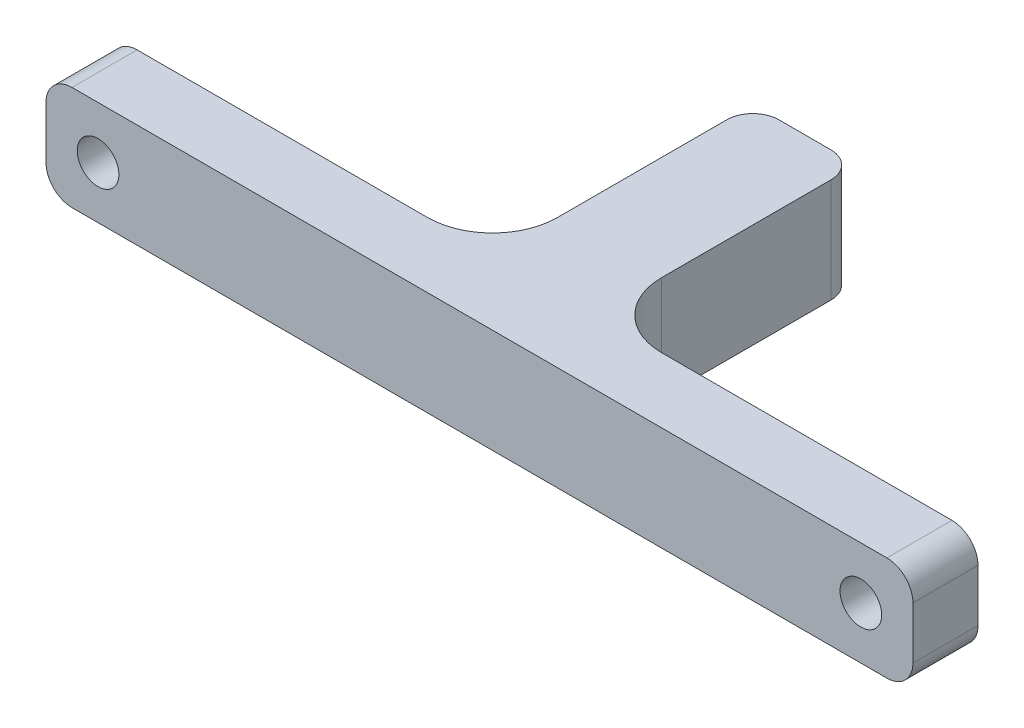
ISO-10303-21;
HEADER;
FILE_DESCRIPTION(('STEP AP214'),'2;1');
FILE_NAME('part.step','',(''),(''),'','','');
FILE_SCHEMA(('AUTOMOTIVE_DESIGN { 1 0 10303 214 1 1 1 1 }'));
ENDSEC;
DATA;
#1=APPLICATION_CONTEXT('core data for automotive mechanical design processes');
#2=APPLICATION_PROTOCOL_DEFINITION('international standard','automotive_design',2000,#1);
#3=PRODUCT_CONTEXT('',#1,'mechanical');
#4=PRODUCT('Part','Part','',(#3));
#5=PRODUCT_RELATED_PRODUCT_CATEGORY('part','',(#4));
#6=PRODUCT_DEFINITION_FORMATION('','',#4);
#7=PRODUCT_DEFINITION_CONTEXT('part definition',#1,'design');
#8=PRODUCT_DEFINITION('design','',#6,#7);
#9=PRODUCT_DEFINITION_SHAPE('','',#8);
#10=(LENGTH_UNIT() NAMED_UNIT(*) SI_UNIT(.MILLI.,.METRE.));
#11=(NAMED_UNIT(*) PLANE_ANGLE_UNIT() SI_UNIT($,.RADIAN.));
#12=(NAMED_UNIT(*) SI_UNIT($,.STERADIAN.) SOLID_ANGLE_UNIT());
#13=UNCERTAINTY_MEASURE_WITH_UNIT(LENGTH_MEASURE(1.E-05),#10,'distance_accuracy_value','');
#14=(GEOMETRIC_REPRESENTATION_CONTEXT(3) GLOBAL_UNCERTAINTY_ASSIGNED_CONTEXT((#13)) GLOBAL_UNIT_ASSIGNED_CONTEXT((#10,
#11,#12)) REPRESENTATION_CONTEXT('',''));
#15=CARTESIAN_POINT('',(0.,0.,0.));
#16=DIRECTION('',(0.,0.,1.));
#17=DIRECTION('',(1.,0.,0.));
#18=AXIS2_PLACEMENT_3D('',#15,#16,#17);
#19=CARTESIAN_POINT('',(0.,0.,0.));
#20=DIRECTION('',(0.,0.,1.));
#21=DIRECTION('',(1.,0.,0.));
#22=AXIS2_PLACEMENT_3D('',#19,#20,#21);
#23=PLANE('',#22);
#24=CARTESIAN_POINT('',(-29.3,0.,0.));
#25=DIRECTION('',(0.,0.,1.));
#26=DIRECTION('',(1.,0.,0.));
#27=AXIS2_PLACEMENT_3D('',#24,#25,#26);
#28=CIRCLE('',#27,1.6);
#29=CARTESIAN_POINT('',(-27.7,0.,0.));
#30=VERTEX_POINT('',#29);
#31=EDGE_CURVE('E283',#30,#30,#28,.T.);
#32=ORIENTED_EDGE('',*,*,#31,.T.);
#33=EDGE_LOOP('',(#32));
#34=FACE_BOUND('',#33,.T.);
#35=DIRECTION('',(-1.,0.,0.));
#36=VECTOR('',#35,1.);
#37=CARTESIAN_POINT('',(33.3,4.00000000000001,0.));
#38=LINE('',#37,#36);
#39=CARTESIAN_POINT('',(-9.00000000000001,4.,0.));
#40=VERTEX_POINT('',#39);
#41=CARTESIAN_POINT('',(-31.3,3.99999999999999,0.));
#42=VERTEX_POINT('',#41);
#43=EDGE_CURVE('E176',#40,#42,#38,.T.);
#44=ORIENTED_EDGE('',*,*,#43,.F.);
#45=DIRECTION('',(0.,1.,0.));
#46=VECTOR('',#45,1.);
#47=CARTESIAN_POINT('',(-9.00000000000001,0.,0.));
#48=LINE('',#47,#46);
#49=CARTESIAN_POINT('',(-9.00000000000001,-4.,0.));
#50=VERTEX_POINT('',#49);
#51=EDGE_CURVE('E225',#40,#50,#48,.F.);
#52=ORIENTED_EDGE('',*,*,#51,.T.);
#53=DIRECTION('',(1.,0.,0.));
#54=VECTOR('',#53,1.);
#55=CARTESIAN_POINT('',(33.3,-3.99999999999999,0.));
#56=LINE('',#55,#54);
#57=CARTESIAN_POINT('',(-31.3,-4.,0.));
#58=VERTEX_POINT('',#57);
#59=EDGE_CURVE('E177',#58,#50,#56,.T.);
#60=ORIENTED_EDGE('',*,*,#59,.F.);
#61=CARTESIAN_POINT('',(-31.3,-2.,0.));
#62=DIRECTION('',(0.,0.,1.));
#63=DIRECTION('',(1.,0.,0.));
#64=AXIS2_PLACEMENT_3D('',#61,#62,#63);
#65=CIRCLE('',#64,2.);
#66=CARTESIAN_POINT('',(-33.3,-2.,0.));
#67=VERTEX_POINT('',#66);
#68=EDGE_CURVE('E210',#58,#67,#65,.F.);
#69=ORIENTED_EDGE('',*,*,#68,.T.);
#70=DIRECTION('',(0.,-1.,0.));
#71=VECTOR('',#70,1.);
#72=CARTESIAN_POINT('',(-33.3,-4.,0.));
#73=LINE('',#72,#71);
#74=CARTESIAN_POINT('',(-33.3,1.99999999999999,0.));
#75=VERTEX_POINT('',#74);
#76=EDGE_CURVE('E291',#75,#67,#73,.T.);
#77=ORIENTED_EDGE('',*,*,#76,.F.);
#78=CARTESIAN_POINT('',(-31.3,1.99999999999999,0.));
#79=DIRECTION('',(0.,0.,1.));
#80=DIRECTION('',(1.,0.,0.));
#81=AXIS2_PLACEMENT_3D('',#78,#79,#80);
#82=CIRCLE('',#81,2.);
#83=EDGE_CURVE('E207',#75,#42,#82,.F.);
#84=ORIENTED_EDGE('',*,*,#83,.T.);
#85=EDGE_LOOP('',(#44,#52,#60,#69,#77,#84));
#86=FACE_BOUND('',#85,.T.);
#87=ADVANCED_FACE('F37',(#34,#86),#23,.F.);
#88=CARTESIAN_POINT('',(0.,0.,5.));
#89=DIRECTION('',(0.,0.,1.));
#90=DIRECTION('',(1.,0.,0.));
#91=AXIS2_PLACEMENT_3D('',#88,#89,#90);
#92=PLANE('',#91);
#93=CARTESIAN_POINT('',(-29.3,0.,5.));
#94=DIRECTION('',(0.,0.,1.));
#95=DIRECTION('',(1.,0.,0.));
#96=AXIS2_PLACEMENT_3D('',#93,#94,#95);
#97=CIRCLE('',#96,1.6);
#98=CARTESIAN_POINT('',(-27.7,0.,5.));
#99=VERTEX_POINT('',#98);
#100=EDGE_CURVE('E288',#99,#99,#97,.T.);
#101=ORIENTED_EDGE('',*,*,#100,.F.);
#102=EDGE_LOOP('',(#101));
#103=FACE_BOUND('',#102,.T.);
#104=DIRECTION('',(1.,0.,0.));
#105=VECTOR('',#104,1.);
#106=CARTESIAN_POINT('',(33.3,-3.99999999999999,5.));
#107=LINE('',#106,#105);
#108=CARTESIAN_POINT('',(-31.3,-4.,5.));
#109=VERTEX_POINT('',#108);
#110=CARTESIAN_POINT('',(31.3,-3.99999999999999,5.));
#111=VERTEX_POINT('',#110);
#112=EDGE_CURVE('E296',#109,#111,#107,.T.);
#113=ORIENTED_EDGE('',*,*,#112,.T.);
#114=CARTESIAN_POINT('',(31.3,-2.,5.));
#115=DIRECTION('',(0.,0.,1.));
#116=DIRECTION('',(1.,0.,0.));
#117=AXIS2_PLACEMENT_3D('',#114,#115,#116);
#118=CIRCLE('',#117,2.);
#119=CARTESIAN_POINT('',(33.3,-2.,5.));
#120=VERTEX_POINT('',#119);
#121=EDGE_CURVE('E200',#111,#120,#118,.T.);
#122=ORIENTED_EDGE('',*,*,#121,.T.);
#123=DIRECTION('',(0.,1.,0.));
#124=VECTOR('',#123,1.);
#125=CARTESIAN_POINT('',(33.3,-3.99999999999999,5.));
#126=LINE('',#125,#124);
#127=CARTESIAN_POINT('',(33.3,2.00000000000001,5.));
#128=VERTEX_POINT('',#127);
#129=EDGE_CURVE('E170',#120,#128,#126,.T.);
#130=ORIENTED_EDGE('',*,*,#129,.T.);
#131=CARTESIAN_POINT('',(31.3,2.,5.));
#132=DIRECTION('',(0.,0.,1.));
#133=DIRECTION('',(1.,0.,0.));
#134=AXIS2_PLACEMENT_3D('',#131,#132,#133);
#135=CIRCLE('',#134,2.);
#136=CARTESIAN_POINT('',(31.3,4.00000000000001,5.));
#137=VERTEX_POINT('',#136);
#138=EDGE_CURVE('E198',#128,#137,#135,.T.);
#139=ORIENTED_EDGE('',*,*,#138,.T.);
#140=DIRECTION('',(-1.,0.,0.));
#141=VECTOR('',#140,1.);
#142=CARTESIAN_POINT('',(33.3,4.00000000000001,5.));
#143=LINE('',#142,#141);
#144=CARTESIAN_POINT('',(-31.3,3.99999999999999,5.));
#145=VERTEX_POINT('',#144);
#146=EDGE_CURVE('E188',#137,#145,#143,.T.);
#147=ORIENTED_EDGE('',*,*,#146,.T.);
#148=CARTESIAN_POINT('',(-31.3,1.99999999999999,5.));
#149=DIRECTION('',(0.,0.,1.));
#150=DIRECTION('',(1.,0.,0.));
#151=AXIS2_PLACEMENT_3D('',#148,#149,#150);
#152=CIRCLE('',#151,2.);
#153=CARTESIAN_POINT('',(-33.3,1.99999999999999,5.));
#154=VERTEX_POINT('',#153);
#155=EDGE_CURVE('E194',#145,#154,#152,.T.);
#156=ORIENTED_EDGE('',*,*,#155,.T.);
#157=DIRECTION('',(0.,-1.,0.));
#158=VECTOR('',#157,1.);
#159=CARTESIAN_POINT('',(-33.3,-4.,5.));
#160=LINE('',#159,#158);
#161=CARTESIAN_POINT('',(-33.3,-2.,5.));
#162=VERTEX_POINT('',#161);
#163=EDGE_CURVE('E187',#154,#162,#160,.T.);
#164=ORIENTED_EDGE('',*,*,#163,.T.);
#165=CARTESIAN_POINT('',(-31.3,-2.,5.));
#166=DIRECTION('',(0.,0.,1.));
#167=DIRECTION('',(1.,0.,0.));
#168=AXIS2_PLACEMENT_3D('',#165,#166,#167);
#169=CIRCLE('',#168,2.);
#170=EDGE_CURVE('E196',#162,#109,#169,.T.);
#171=ORIENTED_EDGE('',*,*,#170,.T.);
#172=EDGE_LOOP('',(#113,#122,#130,#139,#147,#156,#164,#171));
#173=FACE_BOUND('',#172,.T.);
#174=CARTESIAN_POINT('',(29.3,0.,5.));
#175=DIRECTION('',(0.,0.,1.));
#176=DIRECTION('',(-1.,0.,0.));
#177=AXIS2_PLACEMENT_3D('',#174,#175,#176);
#178=CIRCLE('',#177,1.6);
#179=CARTESIAN_POINT('',(27.7,0.,5.));
#180=VERTEX_POINT('',#179);
#181=EDGE_CURVE('E280',#180,#180,#178,.T.);
#182=ORIENTED_EDGE('',*,*,#181,.F.);
#183=EDGE_LOOP('',(#182));
#184=FACE_BOUND('',#183,.T.);
#185=ADVANCED_FACE('F315',(#103,#173,#184),#92,.T.);
#186=CARTESIAN_POINT('',(9.00000000000001,-4.,0.));
#187=VERTEX_POINT('',#186);
#188=CARTESIAN_POINT('',(31.3,-3.99999999999999,0.));
#189=VERTEX_POINT('',#188);
#190=EDGE_CURVE('E182',#187,#189,#56,.T.);
#191=ORIENTED_EDGE('',*,*,#190,.F.);
#192=DIRECTION('',(0.,1.,0.));
#193=VECTOR('',#192,1.);
#194=CARTESIAN_POINT('',(9.00000000000001,0.,0.));
#195=LINE('',#194,#193);
#196=CARTESIAN_POINT('',(9.00000000000001,4.,0.));
#197=VERTEX_POINT('',#196);
#198=EDGE_CURVE('E217',#187,#197,#195,.T.);
#199=ORIENTED_EDGE('',*,*,#198,.T.);
#200=CARTESIAN_POINT('',(31.3,4.00000000000001,0.));
#201=VERTEX_POINT('',#200);
#202=EDGE_CURVE('E179',#201,#197,#38,.T.);
#203=ORIENTED_EDGE('',*,*,#202,.F.);
#204=CARTESIAN_POINT('',(31.3,2.,0.));
#205=DIRECTION('',(0.,0.,1.));
#206=DIRECTION('',(1.,0.,0.));
#207=AXIS2_PLACEMENT_3D('',#204,#205,#206);
#208=CIRCLE('',#207,2.);
#209=CARTESIAN_POINT('',(33.3,2.00000000000001,0.));
#210=VERTEX_POINT('',#209);
#211=EDGE_CURVE('E161',#201,#210,#208,.F.);
#212=ORIENTED_EDGE('',*,*,#211,.T.);
#213=DIRECTION('',(0.,1.,0.));
#214=VECTOR('',#213,1.);
#215=CARTESIAN_POINT('',(33.3,-3.99999999999999,0.));
#216=LINE('',#215,#214);
#217=CARTESIAN_POINT('',(33.3,-2.,0.));
#218=VERTEX_POINT('',#217);
#219=EDGE_CURVE('E167',#218,#210,#216,.T.);
#220=ORIENTED_EDGE('',*,*,#219,.F.);
#221=CARTESIAN_POINT('',(31.3,-2.,0.));
#222=DIRECTION('',(0.,0.,1.));
#223=DIRECTION('',(1.,0.,0.));
#224=AXIS2_PLACEMENT_3D('',#221,#222,#223);
#225=CIRCLE('',#224,2.);
#226=EDGE_CURVE('E151',#218,#189,#225,.F.);
#227=ORIENTED_EDGE('',*,*,#226,.T.);
#228=EDGE_LOOP('',(#191,#199,#203,#212,#220,#227));
#229=FACE_BOUND('',#228,.T.);
#230=CARTESIAN_POINT('',(29.3,0.,0.));
#231=DIRECTION('',(0.,0.,1.));
#232=DIRECTION('',(-1.,0.,0.));
#233=AXIS2_PLACEMENT_3D('',#230,#231,#232);
#234=CIRCLE('',#233,1.6);
#235=CARTESIAN_POINT('',(27.7,0.,0.));
#236=VERTEX_POINT('',#235);
#237=EDGE_CURVE('E284',#236,#236,#234,.T.);
#238=ORIENTED_EDGE('',*,*,#237,.T.);
#239=EDGE_LOOP('',(#238));
#240=FACE_BOUND('',#239,.T.);
#241=ADVANCED_FACE('F173',(#229,#240),#23,.F.);
#242=CARTESIAN_POINT('',(-33.3,-4.,5.));
#243=DIRECTION('',(1.,0.,0.));
#244=DIRECTION('',(0.,0.,-1.));
#245=AXIS2_PLACEMENT_3D('',#242,#243,#244);
#246=PLANE('',#245);
#247=ORIENTED_EDGE('',*,*,#76,.T.);
#248=DIRECTION('',(0.,0.,-1.));
#249=VECTOR('',#248,1.);
#250=CARTESIAN_POINT('',(-33.3,-2.,5.));
#251=LINE('',#250,#249);
#252=EDGE_CURVE('E215',#67,#162,#251,.F.);
#253=ORIENTED_EDGE('',*,*,#252,.T.);
#254=ORIENTED_EDGE('',*,*,#163,.F.);
#255=DIRECTION('',(0.,0.,-1.));
#256=VECTOR('',#255,1.);
#257=CARTESIAN_POINT('',(-33.3,1.99999999999999,5.));
#258=LINE('',#257,#256);
#259=EDGE_CURVE('E212',#154,#75,#258,.T.);
#260=ORIENTED_EDGE('',*,*,#259,.T.);
#261=EDGE_LOOP('',(#247,#253,#254,#260));
#262=FACE_BOUND('',#261,.T.);
#263=ADVANCED_FACE('F339',(#262),#246,.F.);
#264=CARTESIAN_POINT('',(33.3,-3.99999999999999,5.));
#265=DIRECTION('',(0.,1.,0.));
#266=DIRECTION('',(-1.,0.,0.));
#267=AXIS2_PLACEMENT_3D('',#264,#265,#266);
#268=PLANE('',#267);
#269=DIRECTION('',(-1.,0.,0.));
#270=VECTOR('',#269,1.);
#271=CARTESIAN_POINT('',(-4.,-4.,-20.));
#272=LINE('',#271,#270);
#273=CARTESIAN_POINT('',(2.,-4.,-20.));
#274=VERTEX_POINT('',#273);
#275=CARTESIAN_POINT('',(-2.,-4.,-20.));
#276=VERTEX_POINT('',#275);
#277=EDGE_CURVE('E254',#274,#276,#272,.T.);
#278=ORIENTED_EDGE('',*,*,#277,.F.);
#279=CARTESIAN_POINT('',(2.,-4.,-18.));
#280=DIRECTION('',(0.,1.,0.));
#281=DIRECTION('',(-1.,0.,0.));
#282=AXIS2_PLACEMENT_3D('',#279,#280,#281);
#283=CIRCLE('',#282,2.);
#284=CARTESIAN_POINT('',(4.,-4.,-18.));
#285=VERTEX_POINT('',#284);
#286=EDGE_CURVE('E45',#274,#285,#283,.F.);
#287=ORIENTED_EDGE('',*,*,#286,.T.);
#288=DIRECTION('',(0.,0.,-1.));
#289=VECTOR('',#288,1.);
#290=CARTESIAN_POINT('',(4.,-4.,-20.));
#291=LINE('',#290,#289);
#292=CARTESIAN_POINT('',(4.,-4.,-5.));
#293=VERTEX_POINT('',#292);
#294=EDGE_CURVE('E252',#293,#285,#291,.T.);
#295=ORIENTED_EDGE('',*,*,#294,.F.);
#296=CARTESIAN_POINT('',(9.00000000000001,-4.,-5.));
#297=DIRECTION('',(0.,1.,0.));
#298=DIRECTION('',(-1.,0.,0.));
#299=AXIS2_PLACEMENT_3D('',#296,#297,#298);
#300=CIRCLE('',#299,5.);
#301=EDGE_CURVE('E229',#293,#187,#300,.T.);
#302=ORIENTED_EDGE('',*,*,#301,.T.);
#303=ORIENTED_EDGE('',*,*,#190,.T.);
#304=DIRECTION('',(0.,0.,-1.));
#305=VECTOR('',#304,1.);
#306=CARTESIAN_POINT('',(31.3,-3.99999999999999,5.));
#307=LINE('',#306,#305);
#308=EDGE_CURVE('E156',#189,#111,#307,.F.);
#309=ORIENTED_EDGE('',*,*,#308,.T.);
#310=ORIENTED_EDGE('',*,*,#112,.F.);
#311=DIRECTION('',(0.,0.,-1.));
#312=VECTOR('',#311,1.);
#313=CARTESIAN_POINT('',(-31.3,-4.,5.));
#314=LINE('',#313,#312);
#315=EDGE_CURVE('E160',#109,#58,#314,.T.);
#316=ORIENTED_EDGE('',*,*,#315,.T.);
#317=ORIENTED_EDGE('',*,*,#59,.T.);
#318=CARTESIAN_POINT('',(-9.00000000000001,-4.,-5.));
#319=DIRECTION('',(0.,1.,0.));
#320=DIRECTION('',(-1.,0.,0.));
#321=AXIS2_PLACEMENT_3D('',#318,#319,#320);
#322=CIRCLE('',#321,5.);
#323=CARTESIAN_POINT('',(-4.,-4.,-5.));
#324=VERTEX_POINT('',#323);
#325=EDGE_CURVE('E233',#50,#324,#322,.T.);
#326=ORIENTED_EDGE('',*,*,#325,.T.);
#327=DIRECTION('',(0.,0.,1.));
#328=VECTOR('',#327,1.);
#329=CARTESIAN_POINT('',(-4.,-4.,0.));
#330=LINE('',#329,#328);
#331=CARTESIAN_POINT('',(-4.,-4.,-18.));
#332=VERTEX_POINT('',#331);
#333=EDGE_CURVE('E287',#332,#324,#330,.T.);
#334=ORIENTED_EDGE('',*,*,#333,.F.);
#335=CARTESIAN_POINT('',(-2.,-4.,-18.));
#336=DIRECTION('',(0.,1.,0.));
#337=DIRECTION('',(-1.,0.,0.));
#338=AXIS2_PLACEMENT_3D('',#335,#336,#337);
#339=CIRCLE('',#338,2.);
#340=EDGE_CURVE('E57',#332,#276,#339,.F.);
#341=ORIENTED_EDGE('',*,*,#340,.T.);
#342=EDGE_LOOP('',(#278,#287,#295,#302,#303,#309,#310,#316,#317,#326,#334,#341));
#343=FACE_BOUND('',#342,.T.);
#344=ADVANCED_FACE('F251',(#343),#268,.F.);
#345=CARTESIAN_POINT('',(33.3,-3.99999999999999,5.));
#346=DIRECTION('',(-1.,0.,0.));
#347=DIRECTION('',(0.,0.,1.));
#348=AXIS2_PLACEMENT_3D('',#345,#346,#347);
#349=PLANE('',#348);
#350=ORIENTED_EDGE('',*,*,#129,.F.);
#351=DIRECTION('',(0.,0.,-1.));
#352=VECTOR('',#351,1.);
#353=CARTESIAN_POINT('',(33.3,-2.,5.));
#354=LINE('',#353,#352);
#355=EDGE_CURVE('E155',#120,#218,#354,.T.);
#356=ORIENTED_EDGE('',*,*,#355,.T.);
#357=ORIENTED_EDGE('',*,*,#219,.T.);
#358=DIRECTION('',(0.,0.,-1.));
#359=VECTOR('',#358,1.);
#360=CARTESIAN_POINT('',(33.3,2.00000000000001,5.));
#361=LINE('',#360,#359);
#362=EDGE_CURVE('E171',#210,#128,#361,.F.);
#363=ORIENTED_EDGE('',*,*,#362,.T.);
#364=EDGE_LOOP('',(#350,#356,#357,#363));
#365=FACE_BOUND('',#364,.T.);
#366=ADVANCED_FACE('F166',(#365),#349,.F.);
#367=CARTESIAN_POINT('',(33.3,4.00000000000001,5.));
#368=DIRECTION('',(0.,-1.,0.));
#369=DIRECTION('',(1.,0.,0.));
#370=AXIS2_PLACEMENT_3D('',#367,#368,#369);
#371=PLANE('',#370);
#372=DIRECTION('',(0.,0.,-1.));
#373=VECTOR('',#372,1.);
#374=CARTESIAN_POINT('',(4.,4.,-20.));
#375=LINE('',#374,#373);
#376=CARTESIAN_POINT('',(4.,4.,-5.));
#377=VERTEX_POINT('',#376);
#378=CARTESIAN_POINT('',(4.,4.,-18.));
#379=VERTEX_POINT('',#378);
#380=EDGE_CURVE('E271',#377,#379,#375,.T.);
#381=ORIENTED_EDGE('',*,*,#380,.T.);
#382=CARTESIAN_POINT('',(2.,4.,-18.));
#383=DIRECTION('',(0.,-1.,0.));
#384=DIRECTION('',(1.,0.,0.));
#385=AXIS2_PLACEMENT_3D('',#382,#383,#384);
#386=CIRCLE('',#385,2.);
#387=CARTESIAN_POINT('',(2.,4.,-20.));
#388=VERTEX_POINT('',#387);
#389=EDGE_CURVE('E241',#379,#388,#386,.F.);
#390=ORIENTED_EDGE('',*,*,#389,.T.);
#391=DIRECTION('',(-1.,0.,0.));
#392=VECTOR('',#391,1.);
#393=CARTESIAN_POINT('',(-4.,4.,-20.));
#394=LINE('',#393,#392);
#395=CARTESIAN_POINT('',(-2.,4.,-20.));
#396=VERTEX_POINT('',#395);
#397=EDGE_CURVE('E270',#388,#396,#394,.T.);
#398=ORIENTED_EDGE('',*,*,#397,.T.);
#399=CARTESIAN_POINT('',(-2.,4.,-18.));
#400=DIRECTION('',(0.,-1.,0.));
#401=DIRECTION('',(1.,0.,0.));
#402=AXIS2_PLACEMENT_3D('',#399,#400,#401);
#403=CIRCLE('',#402,2.);
#404=CARTESIAN_POINT('',(-4.,4.,-18.));
#405=VERTEX_POINT('',#404);
#406=EDGE_CURVE('E239',#396,#405,#403,.F.);
#407=ORIENTED_EDGE('',*,*,#406,.T.);
#408=DIRECTION('',(0.,0.,1.));
#409=VECTOR('',#408,1.);
#410=CARTESIAN_POINT('',(-4.,4.,0.));
#411=LINE('',#410,#409);
#412=CARTESIAN_POINT('',(-4.,4.,-5.));
#413=VERTEX_POINT('',#412);
#414=EDGE_CURVE('E263',#405,#413,#411,.T.);
#415=ORIENTED_EDGE('',*,*,#414,.T.);
#416=CARTESIAN_POINT('',(-9.00000000000001,4.,-5.));
#417=DIRECTION('',(0.,-1.,0.));
#418=DIRECTION('',(1.,0.,0.));
#419=AXIS2_PLACEMENT_3D('',#416,#417,#418);
#420=CIRCLE('',#419,5.);
#421=EDGE_CURVE('E231',#413,#40,#420,.T.);
#422=ORIENTED_EDGE('',*,*,#421,.T.);
#423=ORIENTED_EDGE('',*,*,#43,.T.);
#424=DIRECTION('',(0.,0.,-1.));
#425=VECTOR('',#424,1.);
#426=CARTESIAN_POINT('',(-31.3,3.99999999999999,5.));
#427=LINE('',#426,#425);
#428=EDGE_CURVE('E202',#42,#145,#427,.F.);
#429=ORIENTED_EDGE('',*,*,#428,.T.);
#430=ORIENTED_EDGE('',*,*,#146,.F.);
#431=DIRECTION('',(0.,0.,-1.));
#432=VECTOR('',#431,1.);
#433=CARTESIAN_POINT('',(31.3,4.00000000000001,5.));
#434=LINE('',#433,#432);
#435=EDGE_CURVE('E204',#137,#201,#434,.T.);
#436=ORIENTED_EDGE('',*,*,#435,.T.);
#437=ORIENTED_EDGE('',*,*,#202,.T.);
#438=CARTESIAN_POINT('',(9.00000000000001,4.,-5.));
#439=DIRECTION('',(0.,-1.,0.));
#440=DIRECTION('',(1.,0.,0.));
#441=AXIS2_PLACEMENT_3D('',#438,#439,#440);
#442=CIRCLE('',#441,5.);
#443=EDGE_CURVE('E227',#197,#377,#442,.T.);
#444=ORIENTED_EDGE('',*,*,#443,.T.);
#445=EDGE_LOOP('',(#381,#390,#398,#407,#415,#422,#423,#429,#430,#436,#437,#444));
#446=FACE_BOUND('',#445,.T.);
#447=ADVANCED_FACE('F269',(#446),#371,.F.);
#448=CARTESIAN_POINT('',(-29.3,0.,5.));
#449=DIRECTION('',(0.,0.,-1.));
#450=DIRECTION('',(-1.,0.,0.));
#451=AXIS2_PLACEMENT_3D('',#448,#449,#450);
#452=CYLINDRICAL_SURFACE('',#451,1.6);
#453=ORIENTED_EDGE('',*,*,#100,.T.);
#454=EDGE_LOOP('',(#453));
#455=FACE_BOUND('',#454,.T.);
#456=ORIENTED_EDGE('',*,*,#31,.F.);
#457=EDGE_LOOP('',(#456));
#458=FACE_BOUND('',#457,.T.);
#459=ADVANCED_FACE('F362',(#455,#458),#452,.F.);
#460=CARTESIAN_POINT('',(29.3,0.,5.));
#461=DIRECTION('',(0.,0.,-1.));
#462=DIRECTION('',(-1.,0.,0.));
#463=AXIS2_PLACEMENT_3D('',#460,#461,#462);
#464=CYLINDRICAL_SURFACE('',#463,1.6);
#465=ORIENTED_EDGE('',*,*,#181,.T.);
#466=EDGE_LOOP('',(#465));
#467=FACE_BOUND('',#466,.T.);
#468=ORIENTED_EDGE('',*,*,#237,.F.);
#469=EDGE_LOOP('',(#468));
#470=FACE_BOUND('',#469,.T.);
#471=ADVANCED_FACE('F428',(#467,#470),#464,.F.);
#472=CARTESIAN_POINT('',(-4.,-4.,0.));
#473=DIRECTION('',(-1.,0.,0.));
#474=DIRECTION('',(0.,0.,1.));
#475=AXIS2_PLACEMENT_3D('',#472,#473,#474);
#476=PLANE('',#475);
#477=ORIENTED_EDGE('',*,*,#414,.F.);
#478=DIRECTION('',(0.,1.,0.));
#479=VECTOR('',#478,1.);
#480=CARTESIAN_POINT('',(-4.,-4.,-18.));
#481=LINE('',#480,#479);
#482=EDGE_CURVE('E11',#405,#332,#481,.F.);
#483=ORIENTED_EDGE('',*,*,#482,.T.);
#484=ORIENTED_EDGE('',*,*,#333,.T.);
#485=DIRECTION('',(0.,1.,0.));
#486=VECTOR('',#485,1.);
#487=CARTESIAN_POINT('',(-4.,-4.,-5.));
#488=LINE('',#487,#486);
#489=EDGE_CURVE('E222',#324,#413,#488,.T.);
#490=ORIENTED_EDGE('',*,*,#489,.T.);
#491=EDGE_LOOP('',(#477,#483,#484,#490));
#492=FACE_BOUND('',#491,.T.);
#493=ADVANCED_FACE('F330',(#492),#476,.T.);
#494=CARTESIAN_POINT('',(-4.,-4.,-20.));
#495=DIRECTION('',(0.,0.,-1.));
#496=DIRECTION('',(-1.,0.,0.));
#497=AXIS2_PLACEMENT_3D('',#494,#495,#496);
#498=PLANE('',#497);
#499=ORIENTED_EDGE('',*,*,#397,.F.);
#500=DIRECTION('',(0.,1.,0.));
#501=VECTOR('',#500,1.);
#502=CARTESIAN_POINT('',(2.,-4.,-20.));
#503=LINE('',#502,#501);
#504=EDGE_CURVE('E246',#388,#274,#503,.F.);
#505=ORIENTED_EDGE('',*,*,#504,.T.);
#506=ORIENTED_EDGE('',*,*,#277,.T.);
#507=DIRECTION('',(0.,1.,0.));
#508=VECTOR('',#507,1.);
#509=CARTESIAN_POINT('',(-2.,-4.,-20.));
#510=LINE('',#509,#508);
#511=EDGE_CURVE('E243',#276,#396,#510,.T.);
#512=ORIENTED_EDGE('',*,*,#511,.T.);
#513=EDGE_LOOP('',(#499,#505,#506,#512));
#514=FACE_BOUND('',#513,.T.);
#515=ADVANCED_FACE('F273',(#514),#498,.T.);
#516=CARTESIAN_POINT('',(4.,-4.,-20.));
#517=DIRECTION('',(1.,0.,0.));
#518=DIRECTION('',(0.,0.,-1.));
#519=AXIS2_PLACEMENT_3D('',#516,#517,#518);
#520=PLANE('',#519);
#521=ORIENTED_EDGE('',*,*,#294,.T.);
#522=DIRECTION('',(0.,1.,0.));
#523=VECTOR('',#522,1.);
#524=CARTESIAN_POINT('',(4.,-4.,-18.));
#525=LINE('',#524,#523);
#526=EDGE_CURVE('E236',#285,#379,#525,.T.);
#527=ORIENTED_EDGE('',*,*,#526,.T.);
#528=ORIENTED_EDGE('',*,*,#380,.F.);
#529=DIRECTION('',(0.,1.,0.));
#530=VECTOR('',#529,1.);
#531=CARTESIAN_POINT('',(4.,-4.,-5.));
#532=LINE('',#531,#530);
#533=EDGE_CURVE('E220',#377,#293,#532,.F.);
#534=ORIENTED_EDGE('',*,*,#533,.T.);
#535=EDGE_LOOP('',(#521,#527,#528,#534));
#536=FACE_BOUND('',#535,.T.);
#537=ADVANCED_FACE('F259',(#536),#520,.T.);
#538=CARTESIAN_POINT('',(31.3,-2.,5.));
#539=DIRECTION('',(0.,0.,-1.));
#540=DIRECTION('',(-1.,0.,0.));
#541=AXIS2_PLACEMENT_3D('',#538,#539,#540);
#542=CYLINDRICAL_SURFACE('',#541,2.);
#543=ORIENTED_EDGE('',*,*,#121,.F.);
#544=ORIENTED_EDGE('',*,*,#308,.F.);
#545=ORIENTED_EDGE('',*,*,#226,.F.);
#546=ORIENTED_EDGE('',*,*,#355,.F.);
#547=EDGE_LOOP('',(#543,#544,#545,#546));
#548=FACE_BOUND('',#547,.T.);
#549=ADVANCED_FACE('F154',(#548),#542,.T.);
#550=CARTESIAN_POINT('',(31.3,2.,5.));
#551=DIRECTION('',(0.,0.,-1.));
#552=DIRECTION('',(-1.,0.,0.));
#553=AXIS2_PLACEMENT_3D('',#550,#551,#552);
#554=CYLINDRICAL_SURFACE('',#553,2.);
#555=ORIENTED_EDGE('',*,*,#138,.F.);
#556=ORIENTED_EDGE('',*,*,#362,.F.);
#557=ORIENTED_EDGE('',*,*,#211,.F.);
#558=ORIENTED_EDGE('',*,*,#435,.F.);
#559=EDGE_LOOP('',(#555,#556,#557,#558));
#560=FACE_BOUND('',#559,.T.);
#561=ADVANCED_FACE('F313',(#560),#554,.T.);
#562=CARTESIAN_POINT('',(-31.3,-2.,5.));
#563=DIRECTION('',(0.,0.,-1.));
#564=DIRECTION('',(-1.,0.,0.));
#565=AXIS2_PLACEMENT_3D('',#562,#563,#564);
#566=CYLINDRICAL_SURFACE('',#565,2.);
#567=ORIENTED_EDGE('',*,*,#170,.F.);
#568=ORIENTED_EDGE('',*,*,#252,.F.);
#569=ORIENTED_EDGE('',*,*,#68,.F.);
#570=ORIENTED_EDGE('',*,*,#315,.F.);
#571=EDGE_LOOP('',(#567,#568,#569,#570));
#572=FACE_BOUND('',#571,.T.);
#573=ADVANCED_FACE('F321',(#572),#566,.T.);
#574=CARTESIAN_POINT('',(-31.3,1.99999999999999,5.));
#575=DIRECTION('',(0.,0.,-1.));
#576=DIRECTION('',(-1.,0.,0.));
#577=AXIS2_PLACEMENT_3D('',#574,#575,#576);
#578=CYLINDRICAL_SURFACE('',#577,2.);
#579=ORIENTED_EDGE('',*,*,#155,.F.);
#580=ORIENTED_EDGE('',*,*,#428,.F.);
#581=ORIENTED_EDGE('',*,*,#83,.F.);
#582=ORIENTED_EDGE('',*,*,#259,.F.);
#583=EDGE_LOOP('',(#579,#580,#581,#582));
#584=FACE_BOUND('',#583,.T.);
#585=ADVANCED_FACE('F337',(#584),#578,.T.);
#586=CARTESIAN_POINT('',(9.00000000000001,0.,-5.));
#587=DIRECTION('',(0.,1.,0.));
#588=DIRECTION('',(-1.,0.,0.));
#589=AXIS2_PLACEMENT_3D('',#586,#587,#588);
#590=CYLINDRICAL_SURFACE('',#589,5.);
#591=ORIENTED_EDGE('',*,*,#301,.F.);
#592=ORIENTED_EDGE('',*,*,#533,.F.);
#593=ORIENTED_EDGE('',*,*,#443,.F.);
#594=ORIENTED_EDGE('',*,*,#198,.F.);
#595=EDGE_LOOP('',(#591,#592,#593,#594));
#596=FACE_BOUND('',#595,.T.);
#597=ADVANCED_FACE('F308',(#596),#590,.F.);
#598=CARTESIAN_POINT('',(-9.00000000000001,-4.,-5.));
#599=DIRECTION('',(0.,1.,0.));
#600=DIRECTION('',(-1.,0.,0.));
#601=AXIS2_PLACEMENT_3D('',#598,#599,#600);
#602=CYLINDRICAL_SURFACE('',#601,5.);
#603=ORIENTED_EDGE('',*,*,#325,.F.);
#604=ORIENTED_EDGE('',*,*,#51,.F.);
#605=ORIENTED_EDGE('',*,*,#421,.F.);
#606=ORIENTED_EDGE('',*,*,#489,.F.);
#607=EDGE_LOOP('',(#603,#604,#605,#606));
#608=FACE_BOUND('',#607,.T.);
#609=ADVANCED_FACE('F328',(#608),#602,.F.);
#610=CARTESIAN_POINT('',(2.,-4.,-18.));
#611=DIRECTION('',(0.,1.,0.));
#612=DIRECTION('',(-1.,0.,0.));
#613=AXIS2_PLACEMENT_3D('',#610,#611,#612);
#614=CYLINDRICAL_SURFACE('',#613,2.);
#615=ORIENTED_EDGE('',*,*,#286,.F.);
#616=ORIENTED_EDGE('',*,*,#504,.F.);
#617=ORIENTED_EDGE('',*,*,#389,.F.);
#618=ORIENTED_EDGE('',*,*,#526,.F.);
#619=EDGE_LOOP('',(#615,#616,#617,#618));
#620=FACE_BOUND('',#619,.T.);
#621=ADVANCED_FACE('F265',(#620),#614,.T.);
#622=CARTESIAN_POINT('',(-2.,-4.,-18.));
#623=DIRECTION('',(0.,1.,0.));
#624=DIRECTION('',(-1.,0.,0.));
#625=AXIS2_PLACEMENT_3D('',#622,#623,#624);
#626=CYLINDRICAL_SURFACE('',#625,2.);
#627=ORIENTED_EDGE('',*,*,#340,.F.);
#628=ORIENTED_EDGE('',*,*,#482,.F.);
#629=ORIENTED_EDGE('',*,*,#406,.F.);
#630=ORIENTED_EDGE('',*,*,#511,.F.);
#631=EDGE_LOOP('',(#627,#628,#629,#630));
#632=FACE_BOUND('',#631,.T.);
#633=ADVANCED_FACE('F39',(#632),#626,.T.);
#634=CLOSED_SHELL('',(#87,#185,#241,#263,#344,#366,#447,#459,#471,#493,#515,#537,#549,#561,#573,
#585,#597,#609,#621,#633));
#635=MANIFOLD_SOLID_BREP('B2',#634);
#636=ADVANCED_BREP_SHAPE_REPRESENTATION('',(#18,#635),#14);
#637=SHAPE_DEFINITION_REPRESENTATION(#9,#636);
ENDSEC;
END-ISO-10303-21;
